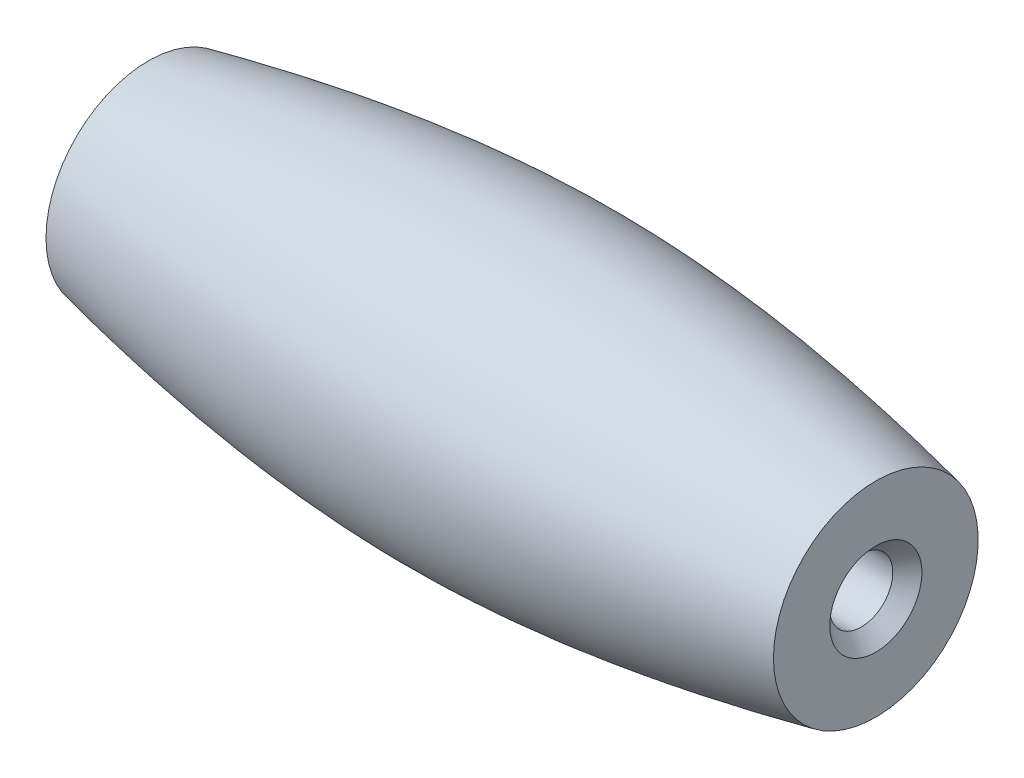
ISO-10303-21;
HEADER;
FILE_DESCRIPTION(('STEP AP214'),'2;1');
FILE_NAME('part.step','',(''),(''),'','','');
FILE_SCHEMA(('AUTOMOTIVE_DESIGN { 1 0 10303 214 1 1 1 1 }'));
ENDSEC;
DATA;
#1=APPLICATION_CONTEXT('core data for automotive mechanical design processes');
#2=APPLICATION_PROTOCOL_DEFINITION('international standard','automotive_design',2000,#1);
#3=PRODUCT_CONTEXT('',#1,'mechanical');
#4=PRODUCT('Part','Part','',(#3));
#5=PRODUCT_RELATED_PRODUCT_CATEGORY('part','',(#4));
#6=PRODUCT_DEFINITION_FORMATION('','',#4);
#7=PRODUCT_DEFINITION_CONTEXT('part definition',#1,'design');
#8=PRODUCT_DEFINITION('design','',#6,#7);
#9=PRODUCT_DEFINITION_SHAPE('','',#8);
#10=(LENGTH_UNIT() NAMED_UNIT(*) SI_UNIT(.MILLI.,.METRE.));
#11=(NAMED_UNIT(*) PLANE_ANGLE_UNIT() SI_UNIT($,.RADIAN.));
#12=(NAMED_UNIT(*) SI_UNIT($,.STERADIAN.) SOLID_ANGLE_UNIT());
#13=UNCERTAINTY_MEASURE_WITH_UNIT(LENGTH_MEASURE(1.E-05),#10,'distance_accuracy_value','');
#14=(GEOMETRIC_REPRESENTATION_CONTEXT(3) GLOBAL_UNCERTAINTY_ASSIGNED_CONTEXT((#13)) GLOBAL_UNIT_ASSIGNED_CONTEXT((#10,
#11,#12)) REPRESENTATION_CONTEXT('',''));
#15=CARTESIAN_POINT('',(0.,0.,0.));
#16=DIRECTION('',(0.,0.,1.));
#17=DIRECTION('',(1.,0.,0.));
#18=AXIS2_PLACEMENT_3D('',#15,#16,#17);
#19=CARTESIAN_POINT('',(4.20225037344023,0.,8.96009297639808));
#20=CARTESIAN_POINT('',(9.28173414110682,0.,7.88041537168416));
#21=CARTESIAN_POINT('',(19.1757656311808,0.,6.47516971258309));
#22=CARTESIAN_POINT('',(29.1757360902924,0.,7.89167438318696));
#23=CARTESIAN_POINT('',(34.2022503734402,0.,8.96009297639809));
#24=B_SPLINE_CURVE_WITH_KNOTS('',3,(#19,#20,#21,#22,#23),.UNSPECIFIED.,.F.,.F.,(4,1,4),(0.,0.5,
1.),.UNSPECIFIED.);
#25=CARTESIAN_POINT('',(4.20225037344023,0.,13.1806072950093));
#26=DIRECTION('',(-1.,0.,0.));
#27=AXIS1_PLACEMENT('',#25,#26);
#28=SURFACE_OF_REVOLUTION('',#24,#27);
#29=CARTESIAN_POINT('',(34.2022503734402,0.,13.1806072950093));
#30=DIRECTION('',(-1.,0.,0.));
#31=DIRECTION('',(0.,0.,1.));
#32=AXIS2_PLACEMENT_3D('',#29,#30,#31);
#33=CIRCLE('',#32,4.22051431861125);
#34=CARTESIAN_POINT('',(34.2022503734402,0.,17.4011216136206));
#35=VERTEX_POINT('',#34);
#36=EDGE_CURVE('E59',#35,#35,#33,.T.);
#37=ORIENTED_EDGE('',*,*,#36,.T.);
#38=EDGE_LOOP('',(#37));
#39=FACE_BOUND('',#38,.T.);
#40=CARTESIAN_POINT('',(4.20225037344023,0.,13.1806072950093));
#41=DIRECTION('',(-1.,0.,0.));
#42=DIRECTION('',(0.,0.,1.));
#43=AXIS2_PLACEMENT_3D('',#40,#41,#42);
#44=CIRCLE('',#43,4.22051431861125);
#45=CARTESIAN_POINT('',(4.20225037344023,0.,17.4011216136206));
#46=VERTEX_POINT('',#45);
#47=EDGE_CURVE('E56',#46,#46,#44,.T.);
#48=ORIENTED_EDGE('',*,*,#47,.F.);
#49=EDGE_LOOP('',(#48));
#50=FACE_BOUND('',#49,.T.);
#51=ADVANCED_FACE('F36',(#39,#50),#28,.F.);
#52=CARTESIAN_POINT('',(4.20225037344023,0.,0.));
#53=DIRECTION('',(-1.,0.,0.));
#54=DIRECTION('',(0.,0.,1.));
#55=AXIS2_PLACEMENT_3D('',#52,#53,#54);
#56=PLANE('',#55);
#57=CARTESIAN_POINT('',(4.20225037344023,0.,13.1806072950093));
#58=DIRECTION('',(-1.,0.,0.));
#59=DIRECTION('',(0.,0.,1.));
#60=AXIS2_PLACEMENT_3D('',#57,#58,#59);
#61=CIRCLE('',#60,1.9);
#62=CARTESIAN_POINT('',(4.20225037344023,0.,15.0806072950093));
#63=VERTEX_POINT('',#62);
#64=EDGE_CURVE('E10',#63,#63,#61,.F.);
#65=ORIENTED_EDGE('',*,*,#64,.T.);
#66=EDGE_LOOP('',(#65));
#67=FACE_BOUND('',#66,.T.);
#68=ORIENTED_EDGE('',*,*,#47,.T.);
#69=EDGE_LOOP('',(#68));
#70=FACE_BOUND('',#69,.T.);
#71=ADVANCED_FACE('F71',(#67,#70),#56,.T.);
#72=CARTESIAN_POINT('',(34.2022503734402,0.,0.));
#73=DIRECTION('',(-1.,0.,0.));
#74=DIRECTION('',(0.,0.,1.));
#75=AXIS2_PLACEMENT_3D('',#72,#73,#74);
#76=PLANE('',#75);
#77=CARTESIAN_POINT('',(34.2022503734402,0.,13.1806072950093));
#78=DIRECTION('',(-1.,0.,0.));
#79=DIRECTION('',(0.,0.,1.));
#80=AXIS2_PLACEMENT_3D('',#77,#78,#79);
#81=CIRCLE('',#80,1.9);
#82=CARTESIAN_POINT('',(34.2022503734402,0.,15.0806072950093));
#83=VERTEX_POINT('',#82);
#84=EDGE_CURVE('E43',#83,#83,#81,.T.);
#85=ORIENTED_EDGE('',*,*,#84,.T.);
#86=EDGE_LOOP('',(#85));
#87=FACE_BOUND('',#86,.T.);
#88=ORIENTED_EDGE('',*,*,#36,.F.);
#89=EDGE_LOOP('',(#88));
#90=FACE_BOUND('',#89,.T.);
#91=ADVANCED_FACE('F83',(#87,#90),#76,.F.);
#92=CARTESIAN_POINT('',(4.20225037344023,0.,13.1806072950093));
#93=DIRECTION('',(1.,0.,0.));
#94=DIRECTION('',(0.,0.,-1.));
#95=AXIS2_PLACEMENT_3D('',#92,#93,#94);
#96=CYLINDRICAL_SURFACE('',#95,1.3);
#97=CARTESIAN_POINT('',(33.6022503734402,0.,13.1806072950093));
#98=DIRECTION('',(-1.,0.,0.));
#99=DIRECTION('',(0.,0.,1.));
#100=AXIS2_PLACEMENT_3D('',#97,#98,#99);
#101=CIRCLE('',#100,1.3);
#102=CARTESIAN_POINT('',(33.6022503734402,0.,14.4806072950093));
#103=VERTEX_POINT('',#102);
#104=EDGE_CURVE('E47',#103,#103,#101,.F.);
#105=ORIENTED_EDGE('',*,*,#104,.T.);
#106=EDGE_LOOP('',(#105));
#107=FACE_BOUND('',#106,.T.);
#108=CARTESIAN_POINT('',(4.80225037344023,0.,13.1806072950093));
#109=DIRECTION('',(-1.,0.,0.));
#110=DIRECTION('',(0.,0.,1.));
#111=AXIS2_PLACEMENT_3D('',#108,#109,#110);
#112=CIRCLE('',#111,1.3);
#113=CARTESIAN_POINT('',(4.80225037344023,0.,14.4806072950093));
#114=VERTEX_POINT('',#113);
#115=EDGE_CURVE('E51',#114,#114,#112,.T.);
#116=ORIENTED_EDGE('',*,*,#115,.T.);
#117=EDGE_LOOP('',(#116));
#118=FACE_BOUND('',#117,.T.);
#119=ADVANCED_FACE('F76',(#107,#118),#96,.F.);
#120=CARTESIAN_POINT('',(33.6022503734402,0.,13.1806072950093));
#121=DIRECTION('',(1.,0.,0.));
#122=DIRECTION('',(0.,0.,-1.));
#123=AXIS2_PLACEMENT_3D('',#120,#121,#122);
#124=CONICAL_SURFACE('',#123,1.3,0.785398163397445);
#125=ORIENTED_EDGE('',*,*,#84,.F.);
#126=EDGE_LOOP('',(#125));
#127=FACE_BOUND('',#126,.T.);
#128=ORIENTED_EDGE('',*,*,#104,.F.);
#129=EDGE_LOOP('',(#128));
#130=FACE_BOUND('',#129,.T.);
#131=ADVANCED_FACE('F74',(#127,#130),#124,.F.);
#132=CARTESIAN_POINT('',(4.20225037344023,0.,13.1806072950093));
#133=DIRECTION('',(-1.,0.,0.));
#134=DIRECTION('',(0.,0.,1.));
#135=AXIS2_PLACEMENT_3D('',#132,#133,#134);
#136=CONICAL_SURFACE('',#135,1.9,0.785398163397448);
#137=ORIENTED_EDGE('',*,*,#115,.F.);
#138=EDGE_LOOP('',(#137));
#139=FACE_BOUND('',#138,.T.);
#140=ORIENTED_EDGE('',*,*,#64,.F.);
#141=EDGE_LOOP('',(#140));
#142=FACE_BOUND('',#141,.T.);
#143=ADVANCED_FACE('F38',(#139,#142),#136,.F.);
#144=CLOSED_SHELL('',(#51,#71,#91,#119,#131,#143));
#145=MANIFOLD_SOLID_BREP('B2',#144);
#146=ADVANCED_BREP_SHAPE_REPRESENTATION('',(#18,#145),#14);
#147=SHAPE_DEFINITION_REPRESENTATION(#9,#146);
ENDSEC;
END-ISO-10303-21;
